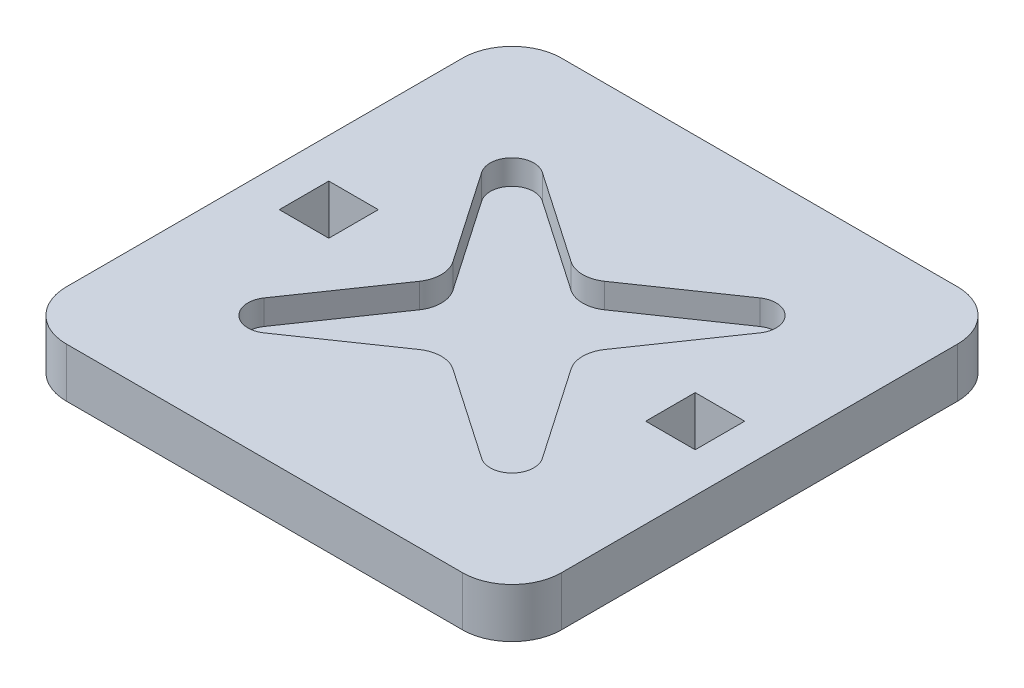
ISO-10303-21;
HEADER;
FILE_DESCRIPTION(('STEP AP214'),'2;1');
FILE_NAME('part.step','',(''),(''),'','','');
FILE_SCHEMA(('AUTOMOTIVE_DESIGN { 1 0 10303 214 1 1 1 1 }'));
ENDSEC;
DATA;
#1=APPLICATION_CONTEXT('core data for automotive mechanical design processes');
#2=APPLICATION_PROTOCOL_DEFINITION('international standard','automotive_design',2000,#1);
#3=PRODUCT_CONTEXT('',#1,'mechanical');
#4=PRODUCT('Part','Part','',(#3));
#5=PRODUCT_RELATED_PRODUCT_CATEGORY('part','',(#4));
#6=PRODUCT_DEFINITION_FORMATION('','',#4);
#7=PRODUCT_DEFINITION_CONTEXT('part definition',#1,'design');
#8=PRODUCT_DEFINITION('design','',#6,#7);
#9=PRODUCT_DEFINITION_SHAPE('','',#8);
#10=(LENGTH_UNIT() NAMED_UNIT(*) SI_UNIT(.MILLI.,.METRE.));
#11=(NAMED_UNIT(*) PLANE_ANGLE_UNIT() SI_UNIT($,.RADIAN.));
#12=(NAMED_UNIT(*) SI_UNIT($,.STERADIAN.) SOLID_ANGLE_UNIT());
#13=UNCERTAINTY_MEASURE_WITH_UNIT(LENGTH_MEASURE(1.E-05),#10,'distance_accuracy_value','');
#14=(GEOMETRIC_REPRESENTATION_CONTEXT(3) GLOBAL_UNCERTAINTY_ASSIGNED_CONTEXT((#13)) GLOBAL_UNIT_ASSIGNED_CONTEXT((#10,
#11,#12)) REPRESENTATION_CONTEXT('',''));
#15=CARTESIAN_POINT('',(0.,0.,0.));
#16=DIRECTION('',(0.,0.,1.));
#17=DIRECTION('',(1.,0.,0.));
#18=AXIS2_PLACEMENT_3D('',#15,#16,#17);
#19=CARTESIAN_POINT('',(5.00000000000001,5.,45.));
#20=DIRECTION('',(0.,1.,0.));
#21=DIRECTION('',(0.,0.,1.));
#22=AXIS2_PLACEMENT_3D('',#19,#20,#21);
#23=PLANE('',#22);
#24=CARTESIAN_POINT('',(12.7650876302582,5.,12.7647970565576));
#25=DIRECTION('',(0.,1.,0.));
#26=DIRECTION('',(0.,0.,1.));
#27=AXIS2_PLACEMENT_3D('',#24,#25,#26);
#28=CIRCLE('',#27,2.1999956);
#29=CARTESIAN_POINT('',(14.0106134662851,5.,10.9513346136577));
#30=VERTEX_POINT('',#29);
#31=CARTESIAN_POINT('',(10.9516251873605,5.,14.0103228925862));
#32=VERTEX_POINT('',#31);
#33=EDGE_CURVE('E48',#30,#32,#28,.T.);
#34=ORIENTED_EDGE('',*,*,#33,.F.);
#35=DIRECTION('',(0.824302759014594,0.,0.566149239583459));
#36=VECTOR('',#35,1.);
#37=CARTESIAN_POINT('',(-0.619999756953856,5.,0.902708110358774));
#38=LINE('',#37,#36);
#39=CARTESIAN_POINT('',(23.2995661570359,5.,17.3311913409141));
#40=VERTEX_POINT('',#39);
#41=EDGE_CURVE('E262',#30,#40,#38,.T.);
#42=ORIENTED_EDGE('',*,*,#41,.T.);
#43=CARTESIAN_POINT('',(24.9980104788908,5.,14.8582880096869));
#44=DIRECTION('',(0.,1.,0.));
#45=DIRECTION('',(0.,0.,1.));
#46=AXIS2_PLACEMENT_3D('',#43,#44,#45);
#47=CIRCLE('',#46,2.999994);
#48=CARTESIAN_POINT('',(26.6964548007458,5.,17.3311913409141));
#49=VERTEX_POINT('',#48);
#50=EDGE_CURVE('E265',#40,#49,#47,.T.);
#51=ORIENTED_EDGE('',*,*,#50,.T.);
#52=DIRECTION('',(0.824302759014592,0.,-0.566149239583461));
#53=VECTOR('',#52,1.);
#54=CARTESIAN_POINT('',(16.6449724486466,5.,24.2347701875145));
#55=LINE('',#54,#53);
#56=CARTESIAN_POINT('',(35.9854074914965,5.,10.9513346136577));
#57=VERTEX_POINT('',#56);
#58=EDGE_CURVE('E333',#49,#57,#55,.T.);
#59=ORIENTED_EDGE('',*,*,#58,.T.);
#60=CARTESIAN_POINT('',(37.2309333275235,5.,12.7647970565576));
#61=DIRECTION('',(0.,1.,0.));
#62=DIRECTION('',(0.,0.,1.));
#63=AXIS2_PLACEMENT_3D('',#60,#61,#62);
#64=CIRCLE('',#63,2.1999956);
#65=CARTESIAN_POINT('',(39.0443957704235,5.,14.0103228925846));
#66=VERTEX_POINT('',#65);
#67=EDGE_CURVE('E330',#66,#57,#64,.T.);
#68=ORIENTED_EDGE('',*,*,#67,.F.);
#69=DIRECTION('',(-0.56614923958346,0.,0.824302759014593));
#70=VECTOR('',#69,1.);
#71=CARTESIAN_POINT('',(33.0680071136899,5.,22.7118335796139));
#72=LINE('',#71,#70);
#73=CARTESIAN_POINT('',(32.6645390431686,5.,23.2992755833331));
#74=VERTEX_POINT('',#73);
#75=EDGE_CURVE('E327',#66,#74,#72,.T.);
#76=ORIENTED_EDGE('',*,*,#75,.T.);
#77=CARTESIAN_POINT('',(35.1374423743958,5.,24.997719905188));
#78=DIRECTION('',(0.,1.,0.));
#79=DIRECTION('',(0.,0.,1.));
#80=AXIS2_PLACEMENT_3D('',#77,#78,#79);
#81=CIRCLE('',#80,2.99999400000002);
#82=CARTESIAN_POINT('',(32.6645390431686,5.,26.696164227043));
#83=VERTEX_POINT('',#82);
#84=EDGE_CURVE('E324',#74,#83,#81,.T.);
#85=ORIENTED_EDGE('',*,*,#84,.T.);
#86=DIRECTION('',(0.566149239583463,0.,0.824302759014591));
#87=VECTOR('',#86,1.);
#88=CARTESIAN_POINT('',(9.7362162454639,5.,-6.68704716017088));
#89=LINE('',#88,#87);
#90=CARTESIAN_POINT('',(39.044395770425,5.,35.9851169177937));
#91=VERTEX_POINT('',#90);
#92=EDGE_CURVE('E321',#83,#91,#89,.T.);
#93=ORIENTED_EDGE('',*,*,#92,.T.);
#94=CARTESIAN_POINT('',(37.2309333275251,5.,37.2306427538207));
#95=DIRECTION('',(0.,1.,0.));
#96=DIRECTION('',(0.,0.,1.));
#97=AXIS2_PLACEMENT_3D('',#94,#95,#96);
#98=CIRCLE('',#97,2.1999956);
#99=CARTESIAN_POINT('',(35.9854074914981,5.,39.0441051967206));
#100=VERTEX_POINT('',#99);
#101=EDGE_CURVE('E318',#100,#91,#98,.T.);
#102=ORIENTED_EDGE('',*,*,#101,.F.);
#103=DIRECTION('',(-0.824302759014593,0.,-0.56614923958346));
#104=VECTOR('',#103,1.);
#105=CARTESIAN_POINT('',(-6.68681841957985,5.,9.73588320341941));
#106=LINE('',#105,#104);
#107=CARTESIAN_POINT('',(26.6964548007496,5.,32.6642484694658));
#108=VERTEX_POINT('',#107);
#109=EDGE_CURVE('E315',#100,#108,#106,.T.);
#110=ORIENTED_EDGE('',*,*,#109,.T.);
#111=CARTESIAN_POINT('',(24.9980104788947,5.,35.137151800693));
#112=DIRECTION('',(0.,1.,0.));
#113=DIRECTION('',(0.,0.,1.));
#114=AXIS2_PLACEMENT_3D('',#111,#112,#113);
#115=CIRCLE('',#114,2.99999400000001);
#116=CARTESIAN_POINT('',(23.2995661570397,5.,32.6642484694658));
#117=VERTEX_POINT('',#116);
#118=EDGE_CURVE('E312',#108,#117,#115,.T.);
#119=ORIENTED_EDGE('',*,*,#118,.T.);
#120=DIRECTION('',(-0.824302759014592,0.,0.566149239583462));
#121=VECTOR('',#120,1.);
#122=CARTESIAN_POINT('',(22.7117911112751,5.,33.0679452805787));
#123=LINE('',#122,#121);
#124=CARTESIAN_POINT('',(14.010613466289,5.,39.0441051967222));
#125=VERTEX_POINT('',#124);
#126=EDGE_CURVE('E309',#117,#125,#123,.T.);
#127=ORIENTED_EDGE('',*,*,#126,.T.);
#128=CARTESIAN_POINT('',(12.765087630262,5.,37.2306427538222));
#129=DIRECTION('',(0.,1.,0.));
#130=DIRECTION('',(0.,0.,1.));
#131=AXIS2_PLACEMENT_3D('',#128,#129,#130);
#132=CIRCLE('',#131,2.1999956);
#133=CARTESIAN_POINT('',(10.9516251873621,5.,35.9851169177953));
#134=VERTEX_POINT('',#133);
#135=EDGE_CURVE('E306',#134,#125,#132,.T.);
#136=ORIENTED_EDGE('',*,*,#135,.F.);
#137=DIRECTION('',(0.566149239583459,0.,-0.824302759014594));
#138=VECTOR('',#137,1.);
#139=CARTESIAN_POINT('',(24.2348320206293,5.,16.6450149169878));
#140=LINE('',#139,#138);
#141=CARTESIAN_POINT('',(17.3314819146169,5.,26.6961642270468));
#142=VERTEX_POINT('',#141);
#143=EDGE_CURVE('E303',#134,#142,#140,.T.);
#144=ORIENTED_EDGE('',*,*,#143,.T.);
#145=CARTESIAN_POINT('',(14.8585785833897,5.,24.9977199051918));
#146=DIRECTION('',(0.,1.,0.));
#147=DIRECTION('',(0.,0.,1.));
#148=AXIS2_PLACEMENT_3D('',#145,#146,#147);
#149=CIRCLE('',#148,2.99999400000001);
#150=CARTESIAN_POINT('',(17.3314819146169,5.,23.2992755833369));
#151=VERTEX_POINT('',#150);
#152=EDGE_CURVE('E300',#142,#151,#149,.T.);
#153=ORIENTED_EDGE('',*,*,#152,.T.);
#154=DIRECTION('',(-0.566149239583463,0.,-0.824302759014591));
#155=VECTOR('',#154,1.);
#156=CARTESIAN_POINT('',(0.903041152399766,5.,-0.620228497542433));
#157=LINE('',#156,#155);
#158=EDGE_CURVE('E298',#151,#32,#157,.T.);
#159=ORIENTED_EDGE('',*,*,#158,.T.);
#160=EDGE_LOOP('',(#34,#42,#51,#59,#68,#76,#85,#93,#102,#110,#119,#127,#136,#144,#153,#159));
#161=FACE_BOUND('',#160,.T.);
#162=CARTESIAN_POINT('',(5.00000000000001,5.,45.));
#163=DIRECTION('',(0.,1.,0.));
#164=DIRECTION('',(0.,0.,1.));
#165=AXIS2_PLACEMENT_3D('',#162,#163,#164);
#166=CIRCLE('',#165,5.);
#167=CARTESIAN_POINT('',(0.,5.,45.));
#168=VERTEX_POINT('',#167);
#169=CARTESIAN_POINT('',(5.00000000000005,5.,50.));
#170=VERTEX_POINT('',#169);
#171=EDGE_CURVE('E428',#168,#170,#166,.T.);
#172=ORIENTED_EDGE('',*,*,#171,.T.);
#173=DIRECTION('',(1.,0.,0.));
#174=VECTOR('',#173,1.);
#175=CARTESIAN_POINT('',(5.00000000000005,5.,50.));
#176=LINE('',#175,#174);
#177=CARTESIAN_POINT('',(45.,5.,50.));
#178=VERTEX_POINT('',#177);
#179=EDGE_CURVE('E431',#170,#178,#176,.T.);
#180=ORIENTED_EDGE('',*,*,#179,.T.);
#181=CARTESIAN_POINT('',(45.,5.,45.));
#182=DIRECTION('',(0.,1.,0.));
#183=DIRECTION('',(0.,0.,1.));
#184=AXIS2_PLACEMENT_3D('',#181,#182,#183);
#185=CIRCLE('',#184,5.);
#186=CARTESIAN_POINT('',(50.,5.,45.));
#187=VERTEX_POINT('',#186);
#188=EDGE_CURVE('E434',#178,#187,#185,.T.);
#189=ORIENTED_EDGE('',*,*,#188,.T.);
#190=DIRECTION('',(0.,0.,-1.));
#191=VECTOR('',#190,1.);
#192=CARTESIAN_POINT('',(50.,5.,5.00000000000004));
#193=LINE('',#192,#191);
#194=CARTESIAN_POINT('',(50.,5.,5.00000000000004));
#195=VERTEX_POINT('',#194);
#196=EDGE_CURVE('E436',#187,#195,#193,.T.);
#197=ORIENTED_EDGE('',*,*,#196,.T.);
#198=CARTESIAN_POINT('',(45.,5.,5.));
#199=DIRECTION('',(0.,1.,0.));
#200=DIRECTION('',(0.,0.,1.));
#201=AXIS2_PLACEMENT_3D('',#198,#199,#200);
#202=CIRCLE('',#201,5.);
#203=CARTESIAN_POINT('',(45.,5.,0.));
#204=VERTEX_POINT('',#203);
#205=EDGE_CURVE('E438',#195,#204,#202,.T.);
#206=ORIENTED_EDGE('',*,*,#205,.T.);
#207=DIRECTION('',(-1.,0.,0.));
#208=VECTOR('',#207,1.);
#209=CARTESIAN_POINT('',(5.00000000000004,5.,0.));
#210=LINE('',#209,#208);
#211=CARTESIAN_POINT('',(5.,5.,0.));
#212=VERTEX_POINT('',#211);
#213=EDGE_CURVE('E440',#204,#212,#210,.T.);
#214=ORIENTED_EDGE('',*,*,#213,.T.);
#215=CARTESIAN_POINT('',(5.,5.,5.));
#216=DIRECTION('',(0.,1.,0.));
#217=DIRECTION('',(0.,0.,-1.));
#218=AXIS2_PLACEMENT_3D('',#215,#216,#217);
#219=CIRCLE('',#218,5.);
#220=CARTESIAN_POINT('',(0.,5.,5.00000000000004));
#221=VERTEX_POINT('',#220);
#222=EDGE_CURVE('E442',#212,#221,#219,.T.);
#223=ORIENTED_EDGE('',*,*,#222,.T.);
#224=DIRECTION('',(0.,0.,1.));
#225=VECTOR('',#224,1.);
#226=CARTESIAN_POINT('',(0.,5.,5.00000000000004));
#227=LINE('',#226,#225);
#228=EDGE_CURVE('E444',#221,#168,#227,.T.);
#229=ORIENTED_EDGE('',*,*,#228,.T.);
#230=EDGE_LOOP('',(#172,#180,#189,#197,#206,#214,#223,#229));
#231=FACE_BOUND('',#230,.T.);
#232=DIRECTION('',(-1.,0.,0.));
#233=VECTOR('',#232,1.);
#234=CARTESIAN_POINT('',(4.00000000000001,5.,22.5));
#235=LINE('',#234,#233);
#236=CARTESIAN_POINT('',(9.00000000000001,5.,22.5));
#237=VERTEX_POINT('',#236);
#238=CARTESIAN_POINT('',(4.00000000000001,5.,22.5));
#239=VERTEX_POINT('',#238);
#240=EDGE_CURVE('E399',#237,#239,#235,.T.);
#241=ORIENTED_EDGE('',*,*,#240,.F.);
#242=DIRECTION('',(0.,0.,-1.));
#243=VECTOR('',#242,1.);
#244=CARTESIAN_POINT('',(9.00000000000001,5.,27.5));
#245=LINE('',#244,#243);
#246=CARTESIAN_POINT('',(9.00000000000001,5.,27.5));
#247=VERTEX_POINT('',#246);
#248=EDGE_CURVE('E397',#247,#237,#245,.T.);
#249=ORIENTED_EDGE('',*,*,#248,.F.);
#250=DIRECTION('',(1.,0.,0.));
#251=VECTOR('',#250,1.);
#252=CARTESIAN_POINT('',(4.00000000000001,5.,27.5));
#253=LINE('',#252,#251);
#254=CARTESIAN_POINT('',(4.00000000000001,5.,27.5));
#255=VERTEX_POINT('',#254);
#256=EDGE_CURVE('E405',#255,#247,#253,.T.);
#257=ORIENTED_EDGE('',*,*,#256,.F.);
#258=DIRECTION('',(0.,0.,1.));
#259=VECTOR('',#258,1.);
#260=CARTESIAN_POINT('',(4.00000000000001,5.,27.5));
#261=LINE('',#260,#259);
#262=EDGE_CURVE('E402',#239,#255,#261,.T.);
#263=ORIENTED_EDGE('',*,*,#262,.F.);
#264=EDGE_LOOP('',(#241,#249,#257,#263));
#265=FACE_BOUND('',#264,.T.);
#266=DIRECTION('',(-1.,0.,0.));
#267=VECTOR('',#266,1.);
#268=CARTESIAN_POINT('',(41.,5.,22.5));
#269=LINE('',#268,#267);
#270=CARTESIAN_POINT('',(46.,5.,22.5));
#271=VERTEX_POINT('',#270);
#272=CARTESIAN_POINT('',(41.,5.,22.5));
#273=VERTEX_POINT('',#272);
#274=EDGE_CURVE('E370',#271,#273,#269,.T.);
#275=ORIENTED_EDGE('',*,*,#274,.F.);
#276=DIRECTION('',(0.,0.,-1.));
#277=VECTOR('',#276,1.);
#278=CARTESIAN_POINT('',(46.,5.,27.5));
#279=LINE('',#278,#277);
#280=CARTESIAN_POINT('',(46.,5.,27.5));
#281=VERTEX_POINT('',#280);
#282=EDGE_CURVE('E368',#281,#271,#279,.T.);
#283=ORIENTED_EDGE('',*,*,#282,.F.);
#284=DIRECTION('',(1.,0.,0.));
#285=VECTOR('',#284,1.);
#286=CARTESIAN_POINT('',(41.,5.,27.5));
#287=LINE('',#286,#285);
#288=CARTESIAN_POINT('',(41.,5.,27.5));
#289=VERTEX_POINT('',#288);
#290=EDGE_CURVE('E375',#289,#281,#287,.T.);
#291=ORIENTED_EDGE('',*,*,#290,.F.);
#292=DIRECTION('',(0.,0.,1.));
#293=VECTOR('',#292,1.);
#294=CARTESIAN_POINT('',(41.,5.,27.5));
#295=LINE('',#294,#293);
#296=EDGE_CURVE('E373',#273,#289,#295,.T.);
#297=ORIENTED_EDGE('',*,*,#296,.F.);
#298=EDGE_LOOP('',(#275,#283,#291,#297));
#299=FACE_BOUND('',#298,.T.);
#300=ADVANCED_FACE('F33',(#161,#231,#265,#299),#23,.T.);
#301=CARTESIAN_POINT('',(5.00000000000001,0.,45.));
#302=DIRECTION('',(0.,1.,0.));
#303=DIRECTION('',(0.,0.,1.));
#304=AXIS2_PLACEMENT_3D('',#301,#302,#303);
#305=PLANE('',#304);
#306=DIRECTION('',(0.,0.,-1.));
#307=VECTOR('',#306,1.);
#308=CARTESIAN_POINT('',(9.00000000000001,0.,27.5));
#309=LINE('',#308,#307);
#310=CARTESIAN_POINT('',(9.00000000000001,0.,27.5));
#311=VERTEX_POINT('',#310);
#312=CARTESIAN_POINT('',(9.00000000000001,0.,22.5));
#313=VERTEX_POINT('',#312);
#314=EDGE_CURVE('E396',#311,#313,#309,.T.);
#315=ORIENTED_EDGE('',*,*,#314,.T.);
#316=DIRECTION('',(-1.,0.,0.));
#317=VECTOR('',#316,1.);
#318=CARTESIAN_POINT('',(4.00000000000001,0.,22.5));
#319=LINE('',#318,#317);
#320=CARTESIAN_POINT('',(4.00000000000001,0.,22.5));
#321=VERTEX_POINT('',#320);
#322=EDGE_CURVE('E410',#313,#321,#319,.T.);
#323=ORIENTED_EDGE('',*,*,#322,.T.);
#324=DIRECTION('',(0.,0.,1.));
#325=VECTOR('',#324,1.);
#326=CARTESIAN_POINT('',(4.00000000000001,0.,27.5));
#327=LINE('',#326,#325);
#328=CARTESIAN_POINT('',(4.00000000000001,0.,27.5));
#329=VERTEX_POINT('',#328);
#330=EDGE_CURVE('E413',#321,#329,#327,.T.);
#331=ORIENTED_EDGE('',*,*,#330,.T.);
#332=DIRECTION('',(1.,0.,0.));
#333=VECTOR('',#332,1.);
#334=CARTESIAN_POINT('',(4.00000000000001,0.,27.5));
#335=LINE('',#334,#333);
#336=EDGE_CURVE('E400',#329,#311,#335,.T.);
#337=ORIENTED_EDGE('',*,*,#336,.T.);
#338=EDGE_LOOP('',(#315,#323,#331,#337));
#339=FACE_BOUND('',#338,.T.);
#340=CARTESIAN_POINT('',(5.00000000000001,0.,45.));
#341=DIRECTION('',(0.,1.,0.));
#342=DIRECTION('',(0.,0.,1.));
#343=AXIS2_PLACEMENT_3D('',#340,#341,#342);
#344=CIRCLE('',#343,5.);
#345=CARTESIAN_POINT('',(0.,0.,45.));
#346=VERTEX_POINT('',#345);
#347=CARTESIAN_POINT('',(5.00000000000005,0.,50.));
#348=VERTEX_POINT('',#347);
#349=EDGE_CURVE('E427',#346,#348,#344,.T.);
#350=ORIENTED_EDGE('',*,*,#349,.F.);
#351=DIRECTION('',(0.,0.,1.));
#352=VECTOR('',#351,1.);
#353=CARTESIAN_POINT('',(0.,0.,5.00000000000004));
#354=LINE('',#353,#352);
#355=CARTESIAN_POINT('',(0.,0.,5.00000000000004));
#356=VERTEX_POINT('',#355);
#357=EDGE_CURVE('E432',#356,#346,#354,.T.);
#358=ORIENTED_EDGE('',*,*,#357,.F.);
#359=CARTESIAN_POINT('',(5.,0.,5.));
#360=DIRECTION('',(0.,1.,0.));
#361=DIRECTION('',(0.,0.,-1.));
#362=AXIS2_PLACEMENT_3D('',#359,#360,#361);
#363=CIRCLE('',#362,5.);
#364=CARTESIAN_POINT('',(5.,0.,0.));
#365=VERTEX_POINT('',#364);
#366=EDGE_CURVE('E459',#365,#356,#363,.T.);
#367=ORIENTED_EDGE('',*,*,#366,.F.);
#368=DIRECTION('',(-1.,0.,0.));
#369=VECTOR('',#368,1.);
#370=CARTESIAN_POINT('',(5.00000000000004,0.,0.));
#371=LINE('',#370,#369);
#372=CARTESIAN_POINT('',(45.,0.,0.));
#373=VERTEX_POINT('',#372);
#374=EDGE_CURVE('E457',#373,#365,#371,.T.);
#375=ORIENTED_EDGE('',*,*,#374,.F.);
#376=CARTESIAN_POINT('',(45.,0.,5.));
#377=DIRECTION('',(0.,1.,0.));
#378=DIRECTION('',(0.,0.,1.));
#379=AXIS2_PLACEMENT_3D('',#376,#377,#378);
#380=CIRCLE('',#379,5.);
#381=CARTESIAN_POINT('',(50.,0.,5.00000000000004));
#382=VERTEX_POINT('',#381);
#383=EDGE_CURVE('E455',#382,#373,#380,.T.);
#384=ORIENTED_EDGE('',*,*,#383,.F.);
#385=DIRECTION('',(0.,0.,-1.));
#386=VECTOR('',#385,1.);
#387=CARTESIAN_POINT('',(50.,0.,5.00000000000004));
#388=LINE('',#387,#386);
#389=CARTESIAN_POINT('',(50.,0.,45.));
#390=VERTEX_POINT('',#389);
#391=EDGE_CURVE('E453',#390,#382,#388,.T.);
#392=ORIENTED_EDGE('',*,*,#391,.F.);
#393=CARTESIAN_POINT('',(45.,0.,45.));
#394=DIRECTION('',(0.,1.,0.));
#395=DIRECTION('',(0.,0.,1.));
#396=AXIS2_PLACEMENT_3D('',#393,#394,#395);
#397=CIRCLE('',#396,5.);
#398=CARTESIAN_POINT('',(45.,0.,50.));
#399=VERTEX_POINT('',#398);
#400=EDGE_CURVE('E451',#399,#390,#397,.T.);
#401=ORIENTED_EDGE('',*,*,#400,.F.);
#402=DIRECTION('',(1.,0.,0.));
#403=VECTOR('',#402,1.);
#404=CARTESIAN_POINT('',(5.00000000000005,0.,50.));
#405=LINE('',#404,#403);
#406=EDGE_CURVE('E449',#348,#399,#405,.T.);
#407=ORIENTED_EDGE('',*,*,#406,.F.);
#408=EDGE_LOOP('',(#350,#358,#367,#375,#384,#392,#401,#407));
#409=FACE_BOUND('',#408,.T.);
#410=DIRECTION('',(0.,0.,-1.));
#411=VECTOR('',#410,1.);
#412=CARTESIAN_POINT('',(46.,0.,27.5));
#413=LINE('',#412,#411);
#414=CARTESIAN_POINT('',(46.,0.,27.5));
#415=VERTEX_POINT('',#414);
#416=CARTESIAN_POINT('',(46.,0.,22.5));
#417=VERTEX_POINT('',#416);
#418=EDGE_CURVE('E340',#415,#417,#413,.T.);
#419=ORIENTED_EDGE('',*,*,#418,.T.);
#420=DIRECTION('',(-1.,0.,0.));
#421=VECTOR('',#420,1.);
#422=CARTESIAN_POINT('',(41.,0.,22.5));
#423=LINE('',#422,#421);
#424=CARTESIAN_POINT('',(41.,0.,22.5));
#425=VERTEX_POINT('',#424);
#426=EDGE_CURVE('E380',#417,#425,#423,.T.);
#427=ORIENTED_EDGE('',*,*,#426,.T.);
#428=DIRECTION('',(0.,0.,1.));
#429=VECTOR('',#428,1.);
#430=CARTESIAN_POINT('',(41.,0.,27.5));
#431=LINE('',#430,#429);
#432=CARTESIAN_POINT('',(41.,0.,27.5));
#433=VERTEX_POINT('',#432);
#434=EDGE_CURVE('E383',#425,#433,#431,.T.);
#435=ORIENTED_EDGE('',*,*,#434,.T.);
#436=DIRECTION('',(1.,0.,0.));
#437=VECTOR('',#436,1.);
#438=CARTESIAN_POINT('',(41.,0.,27.5));
#439=LINE('',#438,#437);
#440=EDGE_CURVE('E371',#433,#415,#439,.T.);
#441=ORIENTED_EDGE('',*,*,#440,.T.);
#442=EDGE_LOOP('',(#419,#427,#435,#441));
#443=FACE_BOUND('',#442,.T.);
#444=ADVANCED_FACE('F489',(#339,#409,#443),#305,.F.);
#445=CARTESIAN_POINT('',(5.00000000000001,5.,45.));
#446=DIRECTION('',(0.,-1.,0.));
#447=DIRECTION('',(0.,0.,-1.));
#448=AXIS2_PLACEMENT_3D('',#445,#446,#447);
#449=CYLINDRICAL_SURFACE('',#448,5.);
#450=ORIENTED_EDGE('',*,*,#349,.T.);
#451=DIRECTION('',(0.,-1.,0.));
#452=VECTOR('',#451,1.);
#453=CARTESIAN_POINT('',(5.00000000000005,5.,50.));
#454=LINE('',#453,#452);
#455=EDGE_CURVE('E11',#170,#348,#454,.T.);
#456=ORIENTED_EDGE('',*,*,#455,.F.);
#457=ORIENTED_EDGE('',*,*,#171,.F.);
#458=DIRECTION('',(0.,-1.,0.));
#459=VECTOR('',#458,1.);
#460=CARTESIAN_POINT('',(0.,5.,45.));
#461=LINE('',#460,#459);
#462=EDGE_CURVE('E446',#168,#346,#461,.T.);
#463=ORIENTED_EDGE('',*,*,#462,.T.);
#464=EDGE_LOOP('',(#450,#456,#457,#463));
#465=FACE_BOUND('',#464,.T.);
#466=ADVANCED_FACE('F35',(#465),#449,.T.);
#467=CARTESIAN_POINT('',(5.00000000000005,5.,50.));
#468=DIRECTION('',(0.,0.,-1.));
#469=DIRECTION('',(-1.,0.,0.));
#470=AXIS2_PLACEMENT_3D('',#467,#468,#469);
#471=PLANE('',#470);
#472=ORIENTED_EDGE('',*,*,#406,.T.);
#473=DIRECTION('',(0.,-1.,0.));
#474=VECTOR('',#473,1.);
#475=CARTESIAN_POINT('',(45.,5.,50.));
#476=LINE('',#475,#474);
#477=EDGE_CURVE('E41',#178,#399,#476,.T.);
#478=ORIENTED_EDGE('',*,*,#477,.F.);
#479=ORIENTED_EDGE('',*,*,#179,.F.);
#480=ORIENTED_EDGE('',*,*,#455,.T.);
#481=EDGE_LOOP('',(#472,#478,#479,#480));
#482=FACE_BOUND('',#481,.T.);
#483=ADVANCED_FACE('F507',(#482),#471,.F.);
#484=CARTESIAN_POINT('',(45.,5.,45.));
#485=DIRECTION('',(0.,-1.,0.));
#486=DIRECTION('',(0.,0.,-1.));
#487=AXIS2_PLACEMENT_3D('',#484,#485,#486);
#488=CYLINDRICAL_SURFACE('',#487,5.);
#489=ORIENTED_EDGE('',*,*,#400,.T.);
#490=DIRECTION('',(0.,-1.,0.));
#491=VECTOR('',#490,1.);
#492=CARTESIAN_POINT('',(50.,5.,45.));
#493=LINE('',#492,#491);
#494=EDGE_CURVE('E476',#187,#390,#493,.T.);
#495=ORIENTED_EDGE('',*,*,#494,.F.);
#496=ORIENTED_EDGE('',*,*,#188,.F.);
#497=ORIENTED_EDGE('',*,*,#477,.T.);
#498=EDGE_LOOP('',(#489,#495,#496,#497));
#499=FACE_BOUND('',#498,.T.);
#500=ADVANCED_FACE('F483',(#499),#488,.T.);
#501=CARTESIAN_POINT('',(50.,5.,5.00000000000004));
#502=DIRECTION('',(-1.,0.,0.));
#503=DIRECTION('',(0.,0.,1.));
#504=AXIS2_PLACEMENT_3D('',#501,#502,#503);
#505=PLANE('',#504);
#506=ORIENTED_EDGE('',*,*,#391,.T.);
#507=DIRECTION('',(0.,-1.,0.));
#508=VECTOR('',#507,1.);
#509=CARTESIAN_POINT('',(50.,5.,5.00000000000004));
#510=LINE('',#509,#508);
#511=EDGE_CURVE('E473',#195,#382,#510,.T.);
#512=ORIENTED_EDGE('',*,*,#511,.F.);
#513=ORIENTED_EDGE('',*,*,#196,.F.);
#514=ORIENTED_EDGE('',*,*,#494,.T.);
#515=EDGE_LOOP('',(#506,#512,#513,#514));
#516=FACE_BOUND('',#515,.T.);
#517=ADVANCED_FACE('F495',(#516),#505,.F.);
#518=CARTESIAN_POINT('',(45.,5.,5.));
#519=DIRECTION('',(0.,-1.,0.));
#520=DIRECTION('',(0.,0.,-1.));
#521=AXIS2_PLACEMENT_3D('',#518,#519,#520);
#522=CYLINDRICAL_SURFACE('',#521,5.);
#523=ORIENTED_EDGE('',*,*,#383,.T.);
#524=DIRECTION('',(0.,-1.,0.));
#525=VECTOR('',#524,1.);
#526=CARTESIAN_POINT('',(45.,5.,0.));
#527=LINE('',#526,#525);
#528=EDGE_CURVE('E470',#204,#373,#527,.T.);
#529=ORIENTED_EDGE('',*,*,#528,.F.);
#530=ORIENTED_EDGE('',*,*,#205,.F.);
#531=ORIENTED_EDGE('',*,*,#511,.T.);
#532=EDGE_LOOP('',(#523,#529,#530,#531));
#533=FACE_BOUND('',#532,.T.);
#534=ADVANCED_FACE('F499',(#533),#522,.T.);
#535=CARTESIAN_POINT('',(5.00000000000004,5.,0.));
#536=DIRECTION('',(0.,0.,1.));
#537=DIRECTION('',(1.,0.,0.));
#538=AXIS2_PLACEMENT_3D('',#535,#536,#537);
#539=PLANE('',#538);
#540=ORIENTED_EDGE('',*,*,#374,.T.);
#541=DIRECTION('',(0.,-1.,0.));
#542=VECTOR('',#541,1.);
#543=CARTESIAN_POINT('',(5.,5.,0.));
#544=LINE('',#543,#542);
#545=EDGE_CURVE('E467',#212,#365,#544,.T.);
#546=ORIENTED_EDGE('',*,*,#545,.F.);
#547=ORIENTED_EDGE('',*,*,#213,.F.);
#548=ORIENTED_EDGE('',*,*,#528,.T.);
#549=EDGE_LOOP('',(#540,#546,#547,#548));
#550=FACE_BOUND('',#549,.T.);
#551=ADVANCED_FACE('F520',(#550),#539,.F.);
#552=CARTESIAN_POINT('',(5.,5.,5.));
#553=DIRECTION('',(0.,-1.,0.));
#554=DIRECTION('',(0.,0.,-1.));
#555=AXIS2_PLACEMENT_3D('',#552,#553,#554);
#556=CYLINDRICAL_SURFACE('',#555,5.);
#557=ORIENTED_EDGE('',*,*,#366,.T.);
#558=DIRECTION('',(0.,-1.,0.));
#559=VECTOR('',#558,1.);
#560=CARTESIAN_POINT('',(0.,5.,5.00000000000004));
#561=LINE('',#560,#559);
#562=EDGE_CURVE('E464',#221,#356,#561,.T.);
#563=ORIENTED_EDGE('',*,*,#562,.F.);
#564=ORIENTED_EDGE('',*,*,#222,.F.);
#565=ORIENTED_EDGE('',*,*,#545,.T.);
#566=EDGE_LOOP('',(#557,#563,#564,#565));
#567=FACE_BOUND('',#566,.T.);
#568=ADVANCED_FACE('F518',(#567),#556,.T.);
#569=CARTESIAN_POINT('',(0.,5.,5.00000000000004));
#570=DIRECTION('',(1.,0.,0.));
#571=DIRECTION('',(0.,0.,-1.));
#572=AXIS2_PLACEMENT_3D('',#569,#570,#571);
#573=PLANE('',#572);
#574=ORIENTED_EDGE('',*,*,#357,.T.);
#575=ORIENTED_EDGE('',*,*,#462,.F.);
#576=ORIENTED_EDGE('',*,*,#228,.F.);
#577=ORIENTED_EDGE('',*,*,#562,.T.);
#578=EDGE_LOOP('',(#574,#575,#576,#577));
#579=FACE_BOUND('',#578,.T.);
#580=ADVANCED_FACE('F513',(#579),#573,.F.);
#581=CARTESIAN_POINT('',(9.00000000000001,5.,27.5));
#582=DIRECTION('',(-1.,0.,0.));
#583=DIRECTION('',(0.,0.,1.));
#584=AXIS2_PLACEMENT_3D('',#581,#582,#583);
#585=PLANE('',#584);
#586=ORIENTED_EDGE('',*,*,#314,.F.);
#587=DIRECTION('',(0.,-1.,0.));
#588=VECTOR('',#587,1.);
#589=CARTESIAN_POINT('',(9.00000000000001,5.,27.5));
#590=LINE('',#589,#588);
#591=EDGE_CURVE('E407',#247,#311,#590,.T.);
#592=ORIENTED_EDGE('',*,*,#591,.F.);
#593=ORIENTED_EDGE('',*,*,#248,.T.);
#594=DIRECTION('',(0.,-1.,0.));
#595=VECTOR('',#594,1.);
#596=CARTESIAN_POINT('',(9.00000000000001,5.,22.5));
#597=LINE('',#596,#595);
#598=EDGE_CURVE('E424',#237,#313,#597,.T.);
#599=ORIENTED_EDGE('',*,*,#598,.T.);
#600=EDGE_LOOP('',(#586,#592,#593,#599));
#601=FACE_BOUND('',#600,.T.);
#602=ADVANCED_FACE('F538',(#601),#585,.T.);
#603=CARTESIAN_POINT('',(4.00000000000001,5.,22.5));
#604=DIRECTION('',(0.,0.,1.));
#605=DIRECTION('',(1.,0.,0.));
#606=AXIS2_PLACEMENT_3D('',#603,#604,#605);
#607=PLANE('',#606);
#608=ORIENTED_EDGE('',*,*,#322,.F.);
#609=ORIENTED_EDGE('',*,*,#598,.F.);
#610=ORIENTED_EDGE('',*,*,#240,.T.);
#611=DIRECTION('',(0.,-1.,0.));
#612=VECTOR('',#611,1.);
#613=CARTESIAN_POINT('',(4.00000000000001,5.,22.5));
#614=LINE('',#613,#612);
#615=EDGE_CURVE('E422',#239,#321,#614,.T.);
#616=ORIENTED_EDGE('',*,*,#615,.T.);
#617=EDGE_LOOP('',(#608,#609,#610,#616));
#618=FACE_BOUND('',#617,.T.);
#619=ADVANCED_FACE('F545',(#618),#607,.T.);
#620=CARTESIAN_POINT('',(4.00000000000001,5.,27.5));
#621=DIRECTION('',(1.,0.,0.));
#622=DIRECTION('',(0.,0.,-1.));
#623=AXIS2_PLACEMENT_3D('',#620,#621,#622);
#624=PLANE('',#623);
#625=ORIENTED_EDGE('',*,*,#330,.F.);
#626=ORIENTED_EDGE('',*,*,#615,.F.);
#627=ORIENTED_EDGE('',*,*,#262,.T.);
#628=DIRECTION('',(0.,-1.,0.));
#629=VECTOR('',#628,1.);
#630=CARTESIAN_POINT('',(4.00000000000001,5.,27.5));
#631=LINE('',#630,#629);
#632=EDGE_CURVE('E420',#255,#329,#631,.T.);
#633=ORIENTED_EDGE('',*,*,#632,.T.);
#634=EDGE_LOOP('',(#625,#626,#627,#633));
#635=FACE_BOUND('',#634,.T.);
#636=ADVANCED_FACE('F550',(#635),#624,.T.);
#637=CARTESIAN_POINT('',(4.00000000000001,5.,27.5));
#638=DIRECTION('',(0.,0.,-1.));
#639=DIRECTION('',(-1.,0.,0.));
#640=AXIS2_PLACEMENT_3D('',#637,#638,#639);
#641=PLANE('',#640);
#642=ORIENTED_EDGE('',*,*,#336,.F.);
#643=ORIENTED_EDGE('',*,*,#632,.F.);
#644=ORIENTED_EDGE('',*,*,#256,.T.);
#645=ORIENTED_EDGE('',*,*,#591,.T.);
#646=EDGE_LOOP('',(#642,#643,#644,#645));
#647=FACE_BOUND('',#646,.T.);
#648=ADVANCED_FACE('F557',(#647),#641,.T.);
#649=CARTESIAN_POINT('',(46.,5.,27.5));
#650=DIRECTION('',(-1.,0.,0.));
#651=DIRECTION('',(0.,0.,1.));
#652=AXIS2_PLACEMENT_3D('',#649,#650,#651);
#653=PLANE('',#652);
#654=ORIENTED_EDGE('',*,*,#418,.F.);
#655=DIRECTION('',(0.,-1.,0.));
#656=VECTOR('',#655,1.);
#657=CARTESIAN_POINT('',(46.,5.,27.5));
#658=LINE('',#657,#656);
#659=EDGE_CURVE('E377',#281,#415,#658,.T.);
#660=ORIENTED_EDGE('',*,*,#659,.F.);
#661=ORIENTED_EDGE('',*,*,#282,.T.);
#662=DIRECTION('',(0.,-1.,0.));
#663=VECTOR('',#662,1.);
#664=CARTESIAN_POINT('',(46.,5.,22.5));
#665=LINE('',#664,#663);
#666=EDGE_CURVE('E393',#271,#417,#665,.T.);
#667=ORIENTED_EDGE('',*,*,#666,.T.);
#668=EDGE_LOOP('',(#654,#660,#661,#667));
#669=FACE_BOUND('',#668,.T.);
#670=ADVANCED_FACE('F577',(#669),#653,.T.);
#671=CARTESIAN_POINT('',(41.,5.,22.5));
#672=DIRECTION('',(0.,0.,1.));
#673=DIRECTION('',(1.,0.,0.));
#674=AXIS2_PLACEMENT_3D('',#671,#672,#673);
#675=PLANE('',#674);
#676=ORIENTED_EDGE('',*,*,#426,.F.);
#677=ORIENTED_EDGE('',*,*,#666,.F.);
#678=ORIENTED_EDGE('',*,*,#274,.T.);
#679=DIRECTION('',(0.,-1.,0.));
#680=VECTOR('',#679,1.);
#681=CARTESIAN_POINT('',(41.,5.,22.5));
#682=LINE('',#681,#680);
#683=EDGE_CURVE('E391',#273,#425,#682,.T.);
#684=ORIENTED_EDGE('',*,*,#683,.T.);
#685=EDGE_LOOP('',(#676,#677,#678,#684));
#686=FACE_BOUND('',#685,.T.);
#687=ADVANCED_FACE('F572',(#686),#675,.T.);
#688=CARTESIAN_POINT('',(41.,5.,27.5));
#689=DIRECTION('',(1.,0.,0.));
#690=DIRECTION('',(0.,0.,-1.));
#691=AXIS2_PLACEMENT_3D('',#688,#689,#690);
#692=PLANE('',#691);
#693=ORIENTED_EDGE('',*,*,#434,.F.);
#694=ORIENTED_EDGE('',*,*,#683,.F.);
#695=ORIENTED_EDGE('',*,*,#296,.T.);
#696=DIRECTION('',(0.,-1.,0.));
#697=VECTOR('',#696,1.);
#698=CARTESIAN_POINT('',(41.,5.,27.5));
#699=LINE('',#698,#697);
#700=EDGE_CURVE('E56',#289,#433,#699,.T.);
#701=ORIENTED_EDGE('',*,*,#700,.T.);
#702=EDGE_LOOP('',(#693,#694,#695,#701));
#703=FACE_BOUND('',#702,.T.);
#704=ADVANCED_FACE('F575',(#703),#692,.T.);
#705=CARTESIAN_POINT('',(41.,5.,27.5));
#706=DIRECTION('',(0.,0.,-1.));
#707=DIRECTION('',(-1.,0.,0.));
#708=AXIS2_PLACEMENT_3D('',#705,#706,#707);
#709=PLANE('',#708);
#710=ORIENTED_EDGE('',*,*,#440,.F.);
#711=ORIENTED_EDGE('',*,*,#700,.F.);
#712=ORIENTED_EDGE('',*,*,#290,.T.);
#713=ORIENTED_EDGE('',*,*,#659,.T.);
#714=EDGE_LOOP('',(#710,#711,#712,#713));
#715=FACE_BOUND('',#714,.T.);
#716=ADVANCED_FACE('F579',(#715),#709,.T.);
#717=CARTESIAN_POINT('',(12.7650876302582,2.5,12.7647970565576));
#718=DIRECTION('',(0.,1.,0.));
#719=DIRECTION('',(0.,0.,1.));
#720=AXIS2_PLACEMENT_3D('',#717,#718,#719);
#721=CYLINDRICAL_SURFACE('',#720,2.1999956);
#722=ORIENTED_EDGE('',*,*,#33,.T.);
#723=DIRECTION('',(0.,1.,0.));
#724=VECTOR('',#723,1.);
#725=CARTESIAN_POINT('',(10.9516251873605,2.5,14.0103228925862));
#726=LINE('',#725,#724);
#727=CARTESIAN_POINT('',(10.9516251873605,2.5,14.0103228925862));
#728=VERTEX_POINT('',#727);
#729=EDGE_CURVE('E246',#728,#32,#726,.T.);
#730=ORIENTED_EDGE('',*,*,#729,.F.);
#731=CARTESIAN_POINT('',(12.7650876302582,2.5,12.7647970565576));
#732=DIRECTION('',(0.,1.,0.));
#733=DIRECTION('',(0.,0.,1.));
#734=AXIS2_PLACEMENT_3D('',#731,#732,#733);
#735=CIRCLE('',#734,2.1999956);
#736=CARTESIAN_POINT('',(14.0106134662851,2.5,10.9513346136577));
#737=VERTEX_POINT('',#736);
#738=EDGE_CURVE('E253',#737,#728,#735,.T.);
#739=ORIENTED_EDGE('',*,*,#738,.F.);
#740=DIRECTION('',(0.,1.,0.));
#741=VECTOR('',#740,1.);
#742=CARTESIAN_POINT('',(14.0106134662851,2.5,10.9513346136577));
#743=LINE('',#742,#741);
#744=EDGE_CURVE('E338',#737,#30,#743,.T.);
#745=ORIENTED_EDGE('',*,*,#744,.T.);
#746=EDGE_LOOP('',(#722,#730,#739,#745));
#747=FACE_BOUND('',#746,.T.);
#748=ADVANCED_FACE('F256',(#747),#721,.F.);
#749=CARTESIAN_POINT('',(-0.619999756953856,2.5,0.902708110358774));
#750=DIRECTION('',(-0.566149239583459,0.,0.824302759014594));
#751=DIRECTION('',(0.824302759014594,0.,0.566149239583459));
#752=AXIS2_PLACEMENT_3D('',#749,#750,#751);
#753=PLANE('',#752);
#754=ORIENTED_EDGE('',*,*,#41,.F.);
#755=ORIENTED_EDGE('',*,*,#744,.F.);
#756=DIRECTION('',(0.824302759014594,0.,0.566149239583459));
#757=VECTOR('',#756,1.);
#758=CARTESIAN_POINT('',(-0.619999756953856,2.5,0.902708110358774));
#759=LINE('',#758,#757);
#760=CARTESIAN_POINT('',(23.2995661570359,2.5,17.3311913409141));
#761=VERTEX_POINT('',#760);
#762=EDGE_CURVE('E257',#737,#761,#759,.T.);
#763=ORIENTED_EDGE('',*,*,#762,.T.);
#764=DIRECTION('',(0.,1.,0.));
#765=VECTOR('',#764,1.);
#766=CARTESIAN_POINT('',(23.2995661570359,2.5,17.3311913409141));
#767=LINE('',#766,#765);
#768=EDGE_CURVE('E341',#761,#40,#767,.T.);
#769=ORIENTED_EDGE('',*,*,#768,.T.);
#770=EDGE_LOOP('',(#754,#755,#763,#769));
#771=FACE_BOUND('',#770,.T.);
#772=ADVANCED_FACE('F586',(#771),#753,.T.);
#773=CARTESIAN_POINT('',(24.9980104788908,2.5,14.8582880096869));
#774=DIRECTION('',(0.,1.,0.));
#775=DIRECTION('',(0.,0.,1.));
#776=AXIS2_PLACEMENT_3D('',#773,#774,#775);
#777=CYLINDRICAL_SURFACE('',#776,2.999994);
#778=ORIENTED_EDGE('',*,*,#50,.F.);
#779=ORIENTED_EDGE('',*,*,#768,.F.);
#780=CARTESIAN_POINT('',(24.9980104788908,2.5,14.8582880096869));
#781=DIRECTION('',(0.,1.,0.));
#782=DIRECTION('',(0.,0.,1.));
#783=AXIS2_PLACEMENT_3D('',#780,#781,#782);
#784=CIRCLE('',#783,2.999994);
#785=CARTESIAN_POINT('',(26.6964548007458,2.5,17.3311913409141));
#786=VERTEX_POINT('',#785);
#787=EDGE_CURVE('E294',#761,#786,#784,.T.);
#788=ORIENTED_EDGE('',*,*,#787,.T.);
#789=DIRECTION('',(0.,1.,0.));
#790=VECTOR('',#789,1.);
#791=CARTESIAN_POINT('',(26.6964548007458,2.5,17.3311913409141));
#792=LINE('',#791,#790);
#793=EDGE_CURVE('E343',#786,#49,#792,.T.);
#794=ORIENTED_EDGE('',*,*,#793,.T.);
#795=EDGE_LOOP('',(#778,#779,#788,#794));
#796=FACE_BOUND('',#795,.T.);
#797=ADVANCED_FACE('F643',(#796),#777,.T.);
#798=CARTESIAN_POINT('',(16.6449724486466,2.5,24.2347701875145));
#799=DIRECTION('',(0.566149239583461,0.,0.824302759014592));
#800=DIRECTION('',(0.824302759014592,0.,-0.566149239583461));
#801=AXIS2_PLACEMENT_3D('',#798,#799,#800);
#802=PLANE('',#801);
#803=ORIENTED_EDGE('',*,*,#58,.F.);
#804=ORIENTED_EDGE('',*,*,#793,.F.);
#805=DIRECTION('',(0.824302759014592,0.,-0.566149239583461));
#806=VECTOR('',#805,1.);
#807=CARTESIAN_POINT('',(16.6449724486466,2.5,24.2347701875145));
#808=LINE('',#807,#806);
#809=CARTESIAN_POINT('',(35.9854074914965,2.5,10.9513346136577));
#810=VERTEX_POINT('',#809);
#811=EDGE_CURVE('E292',#786,#810,#808,.T.);
#812=ORIENTED_EDGE('',*,*,#811,.T.);
#813=DIRECTION('',(0.,1.,0.));
#814=VECTOR('',#813,1.);
#815=CARTESIAN_POINT('',(35.9854074914965,2.5,10.9513346136577));
#816=LINE('',#815,#814);
#817=EDGE_CURVE('E345',#810,#57,#816,.T.);
#818=ORIENTED_EDGE('',*,*,#817,.T.);
#819=EDGE_LOOP('',(#803,#804,#812,#818));
#820=FACE_BOUND('',#819,.T.);
#821=ADVANCED_FACE('F653',(#820),#802,.T.);
#822=CARTESIAN_POINT('',(37.2309333275235,2.5,12.7647970565576));
#823=DIRECTION('',(0.,1.,0.));
#824=DIRECTION('',(0.,0.,1.));
#825=AXIS2_PLACEMENT_3D('',#822,#823,#824);
#826=CYLINDRICAL_SURFACE('',#825,2.1999956);
#827=ORIENTED_EDGE('',*,*,#67,.T.);
#828=ORIENTED_EDGE('',*,*,#817,.F.);
#829=CARTESIAN_POINT('',(37.2309333275235,2.5,12.7647970565576));
#830=DIRECTION('',(0.,1.,0.));
#831=DIRECTION('',(0.,0.,1.));
#832=AXIS2_PLACEMENT_3D('',#829,#830,#831);
#833=CIRCLE('',#832,2.1999956);
#834=CARTESIAN_POINT('',(39.0443957704235,2.5,14.0103228925846));
#835=VERTEX_POINT('',#834);
#836=EDGE_CURVE('E289',#835,#810,#833,.T.);
#837=ORIENTED_EDGE('',*,*,#836,.F.);
#838=DIRECTION('',(0.,1.,0.));
#839=VECTOR('',#838,1.);
#840=CARTESIAN_POINT('',(39.0443957704235,2.5,14.0103228925846));
#841=LINE('',#840,#839);
#842=EDGE_CURVE('E347',#835,#66,#841,.T.);
#843=ORIENTED_EDGE('',*,*,#842,.T.);
#844=EDGE_LOOP('',(#827,#828,#837,#843));
#845=FACE_BOUND('',#844,.T.);
#846=ADVANCED_FACE('F663',(#845),#826,.F.);
#847=CARTESIAN_POINT('',(33.0680071136899,2.5,22.7118335796139));
#848=DIRECTION('',(-0.824302759014593,0.,-0.56614923958346));
#849=DIRECTION('',(-0.56614923958346,0.,0.824302759014593));
#850=AXIS2_PLACEMENT_3D('',#847,#848,#849);
#851=PLANE('',#850);
#852=ORIENTED_EDGE('',*,*,#75,.F.);
#853=ORIENTED_EDGE('',*,*,#842,.F.);
#854=DIRECTION('',(-0.56614923958346,0.,0.824302759014593));
#855=VECTOR('',#854,1.);
#856=CARTESIAN_POINT('',(33.0680071136899,2.5,22.7118335796139));
#857=LINE('',#856,#855);
#858=CARTESIAN_POINT('',(32.6645390431686,2.5,23.2992755833331));
#859=VERTEX_POINT('',#858);
#860=EDGE_CURVE('E287',#835,#859,#857,.T.);
#861=ORIENTED_EDGE('',*,*,#860,.T.);
#862=DIRECTION('',(0.,1.,0.));
#863=VECTOR('',#862,1.);
#864=CARTESIAN_POINT('',(32.6645390431686,2.5,23.2992755833331));
#865=LINE('',#864,#863);
#866=EDGE_CURVE('E349',#859,#74,#865,.T.);
#867=ORIENTED_EDGE('',*,*,#866,.T.);
#868=EDGE_LOOP('',(#852,#853,#861,#867));
#869=FACE_BOUND('',#868,.T.);
#870=ADVANCED_FACE('F674',(#869),#851,.T.);
#871=CARTESIAN_POINT('',(35.1374423743958,2.5,24.997719905188));
#872=DIRECTION('',(0.,1.,0.));
#873=DIRECTION('',(0.,0.,1.));
#874=AXIS2_PLACEMENT_3D('',#871,#872,#873);
#875=CYLINDRICAL_SURFACE('',#874,2.99999400000002);
#876=ORIENTED_EDGE('',*,*,#84,.F.);
#877=ORIENTED_EDGE('',*,*,#866,.F.);
#878=CARTESIAN_POINT('',(35.1374423743958,2.5,24.997719905188));
#879=DIRECTION('',(0.,1.,0.));
#880=DIRECTION('',(0.,0.,1.));
#881=AXIS2_PLACEMENT_3D('',#878,#879,#880);
#882=CIRCLE('',#881,2.99999400000002);
#883=CARTESIAN_POINT('',(32.6645390431686,2.5,26.696164227043));
#884=VERTEX_POINT('',#883);
#885=EDGE_CURVE('E285',#859,#884,#882,.T.);
#886=ORIENTED_EDGE('',*,*,#885,.T.);
#887=DIRECTION('',(0.,1.,0.));
#888=VECTOR('',#887,1.);
#889=CARTESIAN_POINT('',(32.6645390431686,2.5,26.696164227043));
#890=LINE('',#889,#888);
#891=EDGE_CURVE('E351',#884,#83,#890,.T.);
#892=ORIENTED_EDGE('',*,*,#891,.T.);
#893=EDGE_LOOP('',(#876,#877,#886,#892));
#894=FACE_BOUND('',#893,.T.);
#895=ADVANCED_FACE('F684',(#894),#875,.T.);
#896=CARTESIAN_POINT('',(9.7362162454639,2.5,-6.68704716017088));
#897=DIRECTION('',(-0.824302759014591,0.,0.566149239583463));
#898=DIRECTION('',(0.566149239583463,0.,0.824302759014591));
#899=AXIS2_PLACEMENT_3D('',#896,#897,#898);
#900=PLANE('',#899);
#901=ORIENTED_EDGE('',*,*,#92,.F.);
#902=ORIENTED_EDGE('',*,*,#891,.F.);
#903=DIRECTION('',(0.566149239583463,0.,0.824302759014591));
#904=VECTOR('',#903,1.);
#905=CARTESIAN_POINT('',(9.7362162454639,2.5,-6.68704716017088));
#906=LINE('',#905,#904);
#907=CARTESIAN_POINT('',(39.044395770425,2.5,35.9851169177937));
#908=VERTEX_POINT('',#907);
#909=EDGE_CURVE('E283',#884,#908,#906,.T.);
#910=ORIENTED_EDGE('',*,*,#909,.T.);
#911=DIRECTION('',(0.,1.,0.));
#912=VECTOR('',#911,1.);
#913=CARTESIAN_POINT('',(39.044395770425,2.5,35.9851169177937));
#914=LINE('',#913,#912);
#915=EDGE_CURVE('E353',#908,#91,#914,.T.);
#916=ORIENTED_EDGE('',*,*,#915,.T.);
#917=EDGE_LOOP('',(#901,#902,#910,#916));
#918=FACE_BOUND('',#917,.T.);
#919=ADVANCED_FACE('F694',(#918),#900,.T.);
#920=CARTESIAN_POINT('',(37.2309333275251,2.5,37.2306427538207));
#921=DIRECTION('',(0.,1.,0.));
#922=DIRECTION('',(0.,0.,1.));
#923=AXIS2_PLACEMENT_3D('',#920,#921,#922);
#924=CYLINDRICAL_SURFACE('',#923,2.1999956);
#925=ORIENTED_EDGE('',*,*,#101,.T.);
#926=ORIENTED_EDGE('',*,*,#915,.F.);
#927=CARTESIAN_POINT('',(37.2309333275251,2.5,37.2306427538207));
#928=DIRECTION('',(0.,1.,0.));
#929=DIRECTION('',(0.,0.,1.));
#930=AXIS2_PLACEMENT_3D('',#927,#928,#929);
#931=CIRCLE('',#930,2.1999956);
#932=CARTESIAN_POINT('',(35.9854074914981,2.5,39.0441051967206));
#933=VERTEX_POINT('',#932);
#934=EDGE_CURVE('E280',#933,#908,#931,.T.);
#935=ORIENTED_EDGE('',*,*,#934,.F.);
#936=DIRECTION('',(0.,1.,0.));
#937=VECTOR('',#936,1.);
#938=CARTESIAN_POINT('',(35.9854074914981,2.5,39.0441051967206));
#939=LINE('',#938,#937);
#940=EDGE_CURVE('E355',#933,#100,#939,.T.);
#941=ORIENTED_EDGE('',*,*,#940,.T.);
#942=EDGE_LOOP('',(#925,#926,#935,#941));
#943=FACE_BOUND('',#942,.T.);
#944=ADVANCED_FACE('F704',(#943),#924,.F.);
#945=CARTESIAN_POINT('',(-6.68681841957985,2.5,9.73588320341941));
#946=DIRECTION('',(0.56614923958346,0.,-0.824302759014593));
#947=DIRECTION('',(-0.824302759014593,0.,-0.56614923958346));
#948=AXIS2_PLACEMENT_3D('',#945,#946,#947);
#949=PLANE('',#948);
#950=ORIENTED_EDGE('',*,*,#109,.F.);
#951=ORIENTED_EDGE('',*,*,#940,.F.);
#952=DIRECTION('',(-0.824302759014593,0.,-0.56614923958346));
#953=VECTOR('',#952,1.);
#954=CARTESIAN_POINT('',(-6.68681841957985,2.5,9.73588320341941));
#955=LINE('',#954,#953);
#956=CARTESIAN_POINT('',(26.6964548007496,2.5,32.6642484694658));
#957=VERTEX_POINT('',#956);
#958=EDGE_CURVE('E278',#933,#957,#955,.T.);
#959=ORIENTED_EDGE('',*,*,#958,.T.);
#960=DIRECTION('',(0.,1.,0.));
#961=VECTOR('',#960,1.);
#962=CARTESIAN_POINT('',(26.6964548007496,2.5,32.6642484694658));
#963=LINE('',#962,#961);
#964=EDGE_CURVE('E357',#957,#108,#963,.T.);
#965=ORIENTED_EDGE('',*,*,#964,.T.);
#966=EDGE_LOOP('',(#950,#951,#959,#965));
#967=FACE_BOUND('',#966,.T.);
#968=ADVANCED_FACE('F715',(#967),#949,.T.);
#969=CARTESIAN_POINT('',(24.9980104788947,2.5,35.137151800693));
#970=DIRECTION('',(0.,1.,0.));
#971=DIRECTION('',(0.,0.,1.));
#972=AXIS2_PLACEMENT_3D('',#969,#970,#971);
#973=CYLINDRICAL_SURFACE('',#972,2.99999400000001);
#974=ORIENTED_EDGE('',*,*,#118,.F.);
#975=ORIENTED_EDGE('',*,*,#964,.F.);
#976=CARTESIAN_POINT('',(24.9980104788947,2.5,35.137151800693));
#977=DIRECTION('',(0.,1.,0.));
#978=DIRECTION('',(0.,0.,1.));
#979=AXIS2_PLACEMENT_3D('',#976,#977,#978);
#980=CIRCLE('',#979,2.99999400000001);
#981=CARTESIAN_POINT('',(23.2995661570397,2.5,32.6642484694658));
#982=VERTEX_POINT('',#981);
#983=EDGE_CURVE('E276',#957,#982,#980,.T.);
#984=ORIENTED_EDGE('',*,*,#983,.T.);
#985=DIRECTION('',(0.,1.,0.));
#986=VECTOR('',#985,1.);
#987=CARTESIAN_POINT('',(23.2995661570397,2.5,32.6642484694658));
#988=LINE('',#987,#986);
#989=EDGE_CURVE('E359',#982,#117,#988,.T.);
#990=ORIENTED_EDGE('',*,*,#989,.T.);
#991=EDGE_LOOP('',(#974,#975,#984,#990));
#992=FACE_BOUND('',#991,.T.);
#993=ADVANCED_FACE('F725',(#992),#973,.T.);
#994=CARTESIAN_POINT('',(22.7117911112751,2.5,33.0679452805787));
#995=DIRECTION('',(-0.566149239583462,0.,-0.824302759014592));
#996=DIRECTION('',(-0.824302759014592,0.,0.566149239583462));
#997=AXIS2_PLACEMENT_3D('',#994,#995,#996);
#998=PLANE('',#997);
#999=ORIENTED_EDGE('',*,*,#126,.F.);
#1000=ORIENTED_EDGE('',*,*,#989,.F.);
#1001=DIRECTION('',(-0.824302759014592,0.,0.566149239583462));
#1002=VECTOR('',#1001,1.);
#1003=CARTESIAN_POINT('',(22.7117911112751,2.5,33.0679452805787));
#1004=LINE('',#1003,#1002);
#1005=CARTESIAN_POINT('',(14.010613466289,2.5,39.0441051967222));
#1006=VERTEX_POINT('',#1005);
#1007=EDGE_CURVE('E274',#982,#1006,#1004,.T.);
#1008=ORIENTED_EDGE('',*,*,#1007,.T.);
#1009=DIRECTION('',(0.,1.,0.));
#1010=VECTOR('',#1009,1.);
#1011=CARTESIAN_POINT('',(14.010613466289,2.5,39.0441051967222));
#1012=LINE('',#1011,#1010);
#1013=EDGE_CURVE('E361',#1006,#125,#1012,.T.);
#1014=ORIENTED_EDGE('',*,*,#1013,.T.);
#1015=EDGE_LOOP('',(#999,#1000,#1008,#1014));
#1016=FACE_BOUND('',#1015,.T.);
#1017=ADVANCED_FACE('F735',(#1016),#998,.T.);
#1018=CARTESIAN_POINT('',(12.765087630262,2.5,37.2306427538222));
#1019=DIRECTION('',(0.,1.,0.));
#1020=DIRECTION('',(0.,0.,1.));
#1021=AXIS2_PLACEMENT_3D('',#1018,#1019,#1020);
#1022=CYLINDRICAL_SURFACE('',#1021,2.1999956);
#1023=ORIENTED_EDGE('',*,*,#135,.T.);
#1024=ORIENTED_EDGE('',*,*,#1013,.F.);
#1025=CARTESIAN_POINT('',(12.765087630262,2.5,37.2306427538222));
#1026=DIRECTION('',(0.,1.,0.));
#1027=DIRECTION('',(0.,0.,1.));
#1028=AXIS2_PLACEMENT_3D('',#1025,#1026,#1027);
#1029=CIRCLE('',#1028,2.1999956);
#1030=CARTESIAN_POINT('',(10.9516251873621,2.5,35.9851169177953));
#1031=VERTEX_POINT('',#1030);
#1032=EDGE_CURVE('E271',#1031,#1006,#1029,.T.);
#1033=ORIENTED_EDGE('',*,*,#1032,.F.);
#1034=DIRECTION('',(0.,1.,0.));
#1035=VECTOR('',#1034,1.);
#1036=CARTESIAN_POINT('',(10.9516251873621,2.5,35.9851169177953));
#1037=LINE('',#1036,#1035);
#1038=EDGE_CURVE('E363',#1031,#134,#1037,.T.);
#1039=ORIENTED_EDGE('',*,*,#1038,.T.);
#1040=EDGE_LOOP('',(#1023,#1024,#1033,#1039));
#1041=FACE_BOUND('',#1040,.T.);
#1042=ADVANCED_FACE('F745',(#1041),#1022,.F.);
#1043=CARTESIAN_POINT('',(24.2348320206293,2.5,16.6450149169878));
#1044=DIRECTION('',(0.824302759014593,0.,0.566149239583459));
#1045=DIRECTION('',(0.566149239583459,0.,-0.824302759014593));
#1046=AXIS2_PLACEMENT_3D('',#1043,#1044,#1045);
#1047=PLANE('',#1046);
#1048=ORIENTED_EDGE('',*,*,#143,.F.);
#1049=ORIENTED_EDGE('',*,*,#1038,.F.);
#1050=DIRECTION('',(0.566149239583459,0.,-0.824302759014594));
#1051=VECTOR('',#1050,1.);
#1052=CARTESIAN_POINT('',(24.2348320206293,2.5,16.6450149169878));
#1053=LINE('',#1052,#1051);
#1054=CARTESIAN_POINT('',(17.3314819146169,2.5,26.6961642270468));
#1055=VERTEX_POINT('',#1054);
#1056=EDGE_CURVE('E269',#1031,#1055,#1053,.T.);
#1057=ORIENTED_EDGE('',*,*,#1056,.T.);
#1058=DIRECTION('',(0.,1.,0.));
#1059=VECTOR('',#1058,1.);
#1060=CARTESIAN_POINT('',(17.3314819146169,2.5,26.6961642270468));
#1061=LINE('',#1060,#1059);
#1062=EDGE_CURVE('E365',#1055,#142,#1061,.T.);
#1063=ORIENTED_EDGE('',*,*,#1062,.T.);
#1064=EDGE_LOOP('',(#1048,#1049,#1057,#1063));
#1065=FACE_BOUND('',#1064,.T.);
#1066=ADVANCED_FACE('F756',(#1065),#1047,.T.);
#1067=CARTESIAN_POINT('',(14.8585785833897,2.5,24.9977199051918));
#1068=DIRECTION('',(0.,1.,0.));
#1069=DIRECTION('',(0.,0.,1.));
#1070=AXIS2_PLACEMENT_3D('',#1067,#1068,#1069);
#1071=CYLINDRICAL_SURFACE('',#1070,2.99999400000001);
#1072=ORIENTED_EDGE('',*,*,#152,.F.);
#1073=ORIENTED_EDGE('',*,*,#1062,.F.);
#1074=CARTESIAN_POINT('',(14.8585785833897,2.5,24.9977199051918));
#1075=DIRECTION('',(0.,1.,0.));
#1076=DIRECTION('',(0.,0.,1.));
#1077=AXIS2_PLACEMENT_3D('',#1074,#1075,#1076);
#1078=CIRCLE('',#1077,2.99999400000001);
#1079=CARTESIAN_POINT('',(17.3314819146169,2.5,23.2992755833369));
#1080=VERTEX_POINT('',#1079);
#1081=EDGE_CURVE('E252',#1055,#1080,#1078,.T.);
#1082=ORIENTED_EDGE('',*,*,#1081,.T.);
#1083=DIRECTION('',(0.,1.,0.));
#1084=VECTOR('',#1083,1.);
#1085=CARTESIAN_POINT('',(17.3314819146169,2.5,23.2992755833369));
#1086=LINE('',#1085,#1084);
#1087=EDGE_CURVE('E248',#1080,#151,#1086,.T.);
#1088=ORIENTED_EDGE('',*,*,#1087,.T.);
#1089=EDGE_LOOP('',(#1072,#1073,#1082,#1088));
#1090=FACE_BOUND('',#1089,.T.);
#1091=ADVANCED_FACE('F766',(#1090),#1071,.T.);
#1092=CARTESIAN_POINT('',(0.903041152399766,2.5,-0.620228497542433));
#1093=DIRECTION('',(0.824302759014591,0.,-0.566149239583463));
#1094=DIRECTION('',(-0.566149239583463,0.,-0.824302759014591));
#1095=AXIS2_PLACEMENT_3D('',#1092,#1093,#1094);
#1096=PLANE('',#1095);
#1097=ORIENTED_EDGE('',*,*,#158,.F.);
#1098=ORIENTED_EDGE('',*,*,#1087,.F.);
#1099=DIRECTION('',(-0.566149239583463,0.,-0.824302759014591));
#1100=VECTOR('',#1099,1.);
#1101=CARTESIAN_POINT('',(0.903041152399766,2.5,-0.620228497542433));
#1102=LINE('',#1101,#1100);
#1103=EDGE_CURVE('E243',#1080,#728,#1102,.T.);
#1104=ORIENTED_EDGE('',*,*,#1103,.T.);
#1105=ORIENTED_EDGE('',*,*,#729,.T.);
#1106=EDGE_LOOP('',(#1097,#1098,#1104,#1105));
#1107=FACE_BOUND('',#1106,.T.);
#1108=ADVANCED_FACE('F245',(#1107),#1096,.T.);
#1109=CARTESIAN_POINT('',(0.,2.5,0.));
#1110=DIRECTION('',(0.,1.,0.));
#1111=DIRECTION('',(0.,0.,1.));
#1112=AXIS2_PLACEMENT_3D('',#1109,#1110,#1111);
#1113=PLANE('',#1112);
#1114=ORIENTED_EDGE('',*,*,#738,.T.);
#1115=ORIENTED_EDGE('',*,*,#1103,.F.);
#1116=ORIENTED_EDGE('',*,*,#1081,.F.);
#1117=ORIENTED_EDGE('',*,*,#1056,.F.);
#1118=ORIENTED_EDGE('',*,*,#1032,.T.);
#1119=ORIENTED_EDGE('',*,*,#1007,.F.);
#1120=ORIENTED_EDGE('',*,*,#983,.F.);
#1121=ORIENTED_EDGE('',*,*,#958,.F.);
#1122=ORIENTED_EDGE('',*,*,#934,.T.);
#1123=ORIENTED_EDGE('',*,*,#909,.F.);
#1124=ORIENTED_EDGE('',*,*,#885,.F.);
#1125=ORIENTED_EDGE('',*,*,#860,.F.);
#1126=ORIENTED_EDGE('',*,*,#836,.T.);
#1127=ORIENTED_EDGE('',*,*,#811,.F.);
#1128=ORIENTED_EDGE('',*,*,#787,.F.);
#1129=ORIENTED_EDGE('',*,*,#762,.F.);
#1130=EDGE_LOOP('',(#1114,#1115,#1116,#1117,#1118,#1119,#1120,#1121,#1122,#1123,#1124,#1125,
#1126,#1127,#1128,#1129));
#1131=FACE_BOUND('',#1130,.T.);
#1132=ADVANCED_FACE('F260',(#1131),#1113,.T.);
#1133=CLOSED_SHELL('',(#300,#444,#466,#483,#500,#517,#534,#551,#568,#580,#602,#619,#636,#648,
#670,#687,#704,#716,#748,#772,#797,#821,#846,#870,#895,#919,#944,#968,#993,#1017,#1042,#1066,
#1091,#1108,#1132));
#1134=MANIFOLD_SOLID_BREP('B2',#1133);
#1135=ADVANCED_BREP_SHAPE_REPRESENTATION('',(#18,#1134),#14);
#1136=SHAPE_DEFINITION_REPRESENTATION(#9,#1135);
ENDSEC;
END-ISO-10303-21;
